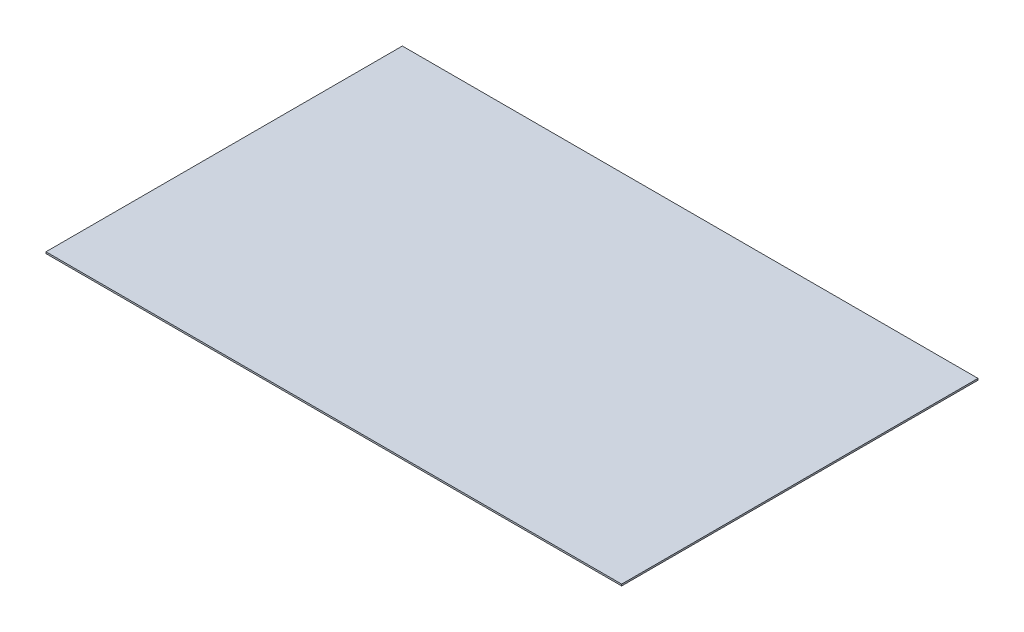
ISO-10303-21;
HEADER;
FILE_DESCRIPTION(('STEP AP214'),'2;1');
FILE_NAME('part.step','',(''),(''),'','','');
FILE_SCHEMA(('AUTOMOTIVE_DESIGN { 1 0 10303 214 1 1 1 1 }'));
ENDSEC;
DATA;
#1=APPLICATION_CONTEXT('core data for automotive mechanical design processes');
#2=APPLICATION_PROTOCOL_DEFINITION('international standard','automotive_design',2000,#1);
#3=PRODUCT_CONTEXT('',#1,'mechanical');
#4=PRODUCT('Part','Part','',(#3));
#5=PRODUCT_RELATED_PRODUCT_CATEGORY('part','',(#4));
#6=PRODUCT_DEFINITION_FORMATION('','',#4);
#7=PRODUCT_DEFINITION_CONTEXT('part definition',#1,'design');
#8=PRODUCT_DEFINITION('design','',#6,#7);
#9=PRODUCT_DEFINITION_SHAPE('','',#8);
#10=(LENGTH_UNIT() NAMED_UNIT(*) SI_UNIT(.MILLI.,.METRE.));
#11=(NAMED_UNIT(*) PLANE_ANGLE_UNIT() SI_UNIT($,.RADIAN.));
#12=(NAMED_UNIT(*) SI_UNIT($,.STERADIAN.) SOLID_ANGLE_UNIT());
#13=UNCERTAINTY_MEASURE_WITH_UNIT(LENGTH_MEASURE(1.E-05),#10,'distance_accuracy_value','');
#14=(GEOMETRIC_REPRESENTATION_CONTEXT(3) GLOBAL_UNCERTAINTY_ASSIGNED_CONTEXT((#13)) GLOBAL_UNIT_ASSIGNED_CONTEXT((#10,
#11,#12)) REPRESENTATION_CONTEXT('',''));
#15=CARTESIAN_POINT('',(0.,0.,0.));
#16=DIRECTION('',(0.,0.,1.));
#17=DIRECTION('',(1.,0.,0.));
#18=AXIS2_PLACEMENT_3D('',#15,#16,#17);
#19=CARTESIAN_POINT('',(525.,3.,-325.));
#20=DIRECTION('',(-1.,0.,0.));
#21=DIRECTION('',(0.,0.,1.));
#22=AXIS2_PLACEMENT_3D('',#19,#20,#21);
#23=PLANE('',#22);
#24=DIRECTION('',(0.,0.,-1.));
#25=VECTOR('',#24,1.);
#26=CARTESIAN_POINT('',(525.,0.,-325.));
#27=LINE('',#26,#25);
#28=CARTESIAN_POINT('',(525.,0.,325.));
#29=VERTEX_POINT('',#28);
#30=CARTESIAN_POINT('',(525.,0.,-325.));
#31=VERTEX_POINT('',#30);
#32=EDGE_CURVE('E109',#29,#31,#27,.T.);
#33=ORIENTED_EDGE('',*,*,#32,.T.);
#34=DIRECTION('',(0.,-1.,0.));
#35=VECTOR('',#34,1.);
#36=CARTESIAN_POINT('',(525.,3.,-325.));
#37=LINE('',#36,#35);
#38=CARTESIAN_POINT('',(525.,3.,-325.));
#39=VERTEX_POINT('',#38);
#40=EDGE_CURVE('E11',#39,#31,#37,.T.);
#41=ORIENTED_EDGE('',*,*,#40,.F.);
#42=DIRECTION('',(0.,0.,-1.));
#43=VECTOR('',#42,1.);
#44=CARTESIAN_POINT('',(525.,3.,-325.));
#45=LINE('',#44,#43);
#46=CARTESIAN_POINT('',(525.,3.,325.));
#47=VERTEX_POINT('',#46);
#48=EDGE_CURVE('E93',#47,#39,#45,.T.);
#49=ORIENTED_EDGE('',*,*,#48,.F.);
#50=DIRECTION('',(0.,-1.,0.));
#51=VECTOR('',#50,1.);
#52=CARTESIAN_POINT('',(525.,3.,325.));
#53=LINE('',#52,#51);
#54=EDGE_CURVE('E105',#47,#29,#53,.T.);
#55=ORIENTED_EDGE('',*,*,#54,.T.);
#56=EDGE_LOOP('',(#33,#41,#49,#55));
#57=FACE_BOUND('',#56,.T.);
#58=ADVANCED_FACE('F41',(#57),#23,.F.);
#59=CARTESIAN_POINT('',(-525.,3.,-325.));
#60=DIRECTION('',(0.,0.,1.));
#61=DIRECTION('',(1.,0.,0.));
#62=AXIS2_PLACEMENT_3D('',#59,#60,#61);
#63=PLANE('',#62);
#64=DIRECTION('',(-1.,0.,0.));
#65=VECTOR('',#64,1.);
#66=CARTESIAN_POINT('',(-525.,0.,-325.));
#67=LINE('',#66,#65);
#68=CARTESIAN_POINT('',(-525.,0.,-325.));
#69=VERTEX_POINT('',#68);
#70=EDGE_CURVE('E98',#31,#69,#67,.T.);
#71=ORIENTED_EDGE('',*,*,#70,.T.);
#72=DIRECTION('',(0.,-1.,0.));
#73=VECTOR('',#72,1.);
#74=CARTESIAN_POINT('',(-525.,3.,-325.));
#75=LINE('',#74,#73);
#76=CARTESIAN_POINT('',(-525.,3.,-325.));
#77=VERTEX_POINT('',#76);
#78=EDGE_CURVE('E50',#77,#69,#75,.T.);
#79=ORIENTED_EDGE('',*,*,#78,.F.);
#80=DIRECTION('',(-1.,0.,0.));
#81=VECTOR('',#80,1.);
#82=CARTESIAN_POINT('',(-525.,3.,-325.));
#83=LINE('',#82,#81);
#84=EDGE_CURVE('E88',#39,#77,#83,.T.);
#85=ORIENTED_EDGE('',*,*,#84,.F.);
#86=ORIENTED_EDGE('',*,*,#40,.T.);
#87=EDGE_LOOP('',(#71,#79,#85,#86));
#88=FACE_BOUND('',#87,.T.);
#89=ADVANCED_FACE('F97',(#88),#63,.F.);
#90=CARTESIAN_POINT('',(-525.,3.,-325.));
#91=DIRECTION('',(1.,0.,0.));
#92=DIRECTION('',(0.,0.,-1.));
#93=AXIS2_PLACEMENT_3D('',#90,#91,#92);
#94=PLANE('',#93);
#95=DIRECTION('',(0.,0.,1.));
#96=VECTOR('',#95,1.);
#97=CARTESIAN_POINT('',(-525.,0.,-325.));
#98=LINE('',#97,#96);
#99=CARTESIAN_POINT('',(-525.,0.,325.));
#100=VERTEX_POINT('',#99);
#101=EDGE_CURVE('E75',#69,#100,#98,.T.);
#102=ORIENTED_EDGE('',*,*,#101,.T.);
#103=DIRECTION('',(0.,-1.,0.));
#104=VECTOR('',#103,1.);
#105=CARTESIAN_POINT('',(-525.,3.,325.));
#106=LINE('',#105,#104);
#107=CARTESIAN_POINT('',(-525.,3.,325.));
#108=VERTEX_POINT('',#107);
#109=EDGE_CURVE('E100',#108,#100,#106,.T.);
#110=ORIENTED_EDGE('',*,*,#109,.F.);
#111=DIRECTION('',(0.,0.,1.));
#112=VECTOR('',#111,1.);
#113=CARTESIAN_POINT('',(-525.,3.,-325.));
#114=LINE('',#113,#112);
#115=EDGE_CURVE('E91',#77,#108,#114,.T.);
#116=ORIENTED_EDGE('',*,*,#115,.F.);
#117=ORIENTED_EDGE('',*,*,#78,.T.);
#118=EDGE_LOOP('',(#102,#110,#116,#117));
#119=FACE_BOUND('',#118,.T.);
#120=ADVANCED_FACE('F101',(#119),#94,.F.);
#121=CARTESIAN_POINT('',(-525.,3.,325.));
#122=DIRECTION('',(0.,0.,-1.));
#123=DIRECTION('',(-1.,0.,0.));
#124=AXIS2_PLACEMENT_3D('',#121,#122,#123);
#125=PLANE('',#124);
#126=DIRECTION('',(1.,0.,0.));
#127=VECTOR('',#126,1.);
#128=CARTESIAN_POINT('',(-525.,0.,325.));
#129=LINE('',#128,#127);
#130=EDGE_CURVE('E81',#100,#29,#129,.T.);
#131=ORIENTED_EDGE('',*,*,#130,.T.);
#132=ORIENTED_EDGE('',*,*,#54,.F.);
#133=DIRECTION('',(1.,0.,0.));
#134=VECTOR('',#133,1.);
#135=CARTESIAN_POINT('',(-525.,3.,325.));
#136=LINE('',#135,#134);
#137=EDGE_CURVE('E58',#108,#47,#136,.T.);
#138=ORIENTED_EDGE('',*,*,#137,.F.);
#139=ORIENTED_EDGE('',*,*,#109,.T.);
#140=EDGE_LOOP('',(#131,#132,#138,#139));
#141=FACE_BOUND('',#140,.T.);
#142=ADVANCED_FACE('F122',(#141),#125,.F.);
#143=CARTESIAN_POINT('',(0.,3.,0.));
#144=DIRECTION('',(0.,1.,0.));
#145=DIRECTION('',(0.,0.,1.));
#146=AXIS2_PLACEMENT_3D('',#143,#144,#145);
#147=PLANE('',#146);
#148=ORIENTED_EDGE('',*,*,#48,.T.);
#149=ORIENTED_EDGE('',*,*,#84,.T.);
#150=ORIENTED_EDGE('',*,*,#115,.T.);
#151=ORIENTED_EDGE('',*,*,#137,.T.);
#152=EDGE_LOOP('',(#148,#149,#150,#151));
#153=FACE_BOUND('',#152,.T.);
#154=ADVANCED_FACE('F89',(#153),#147,.T.);
#155=CARTESIAN_POINT('',(0.,0.,0.));
#156=DIRECTION('',(0.,1.,0.));
#157=DIRECTION('',(0.,0.,1.));
#158=AXIS2_PLACEMENT_3D('',#155,#156,#157);
#159=PLANE('',#158);
#160=ORIENTED_EDGE('',*,*,#32,.F.);
#161=ORIENTED_EDGE('',*,*,#130,.F.);
#162=ORIENTED_EDGE('',*,*,#101,.F.);
#163=ORIENTED_EDGE('',*,*,#70,.F.);
#164=EDGE_LOOP('',(#160,#161,#162,#163));
#165=FACE_BOUND('',#164,.T.);
#166=ADVANCED_FACE('F125',(#165),#159,.F.);
#167=CLOSED_SHELL('',(#58,#89,#120,#142,#154,#166));
#168=MANIFOLD_SOLID_BREP('B2',#167);
#169=ADVANCED_BREP_SHAPE_REPRESENTATION('',(#18,#168),#14);
#170=SHAPE_DEFINITION_REPRESENTATION(#9,#169);
ENDSEC;
END-ISO-10303-21;
